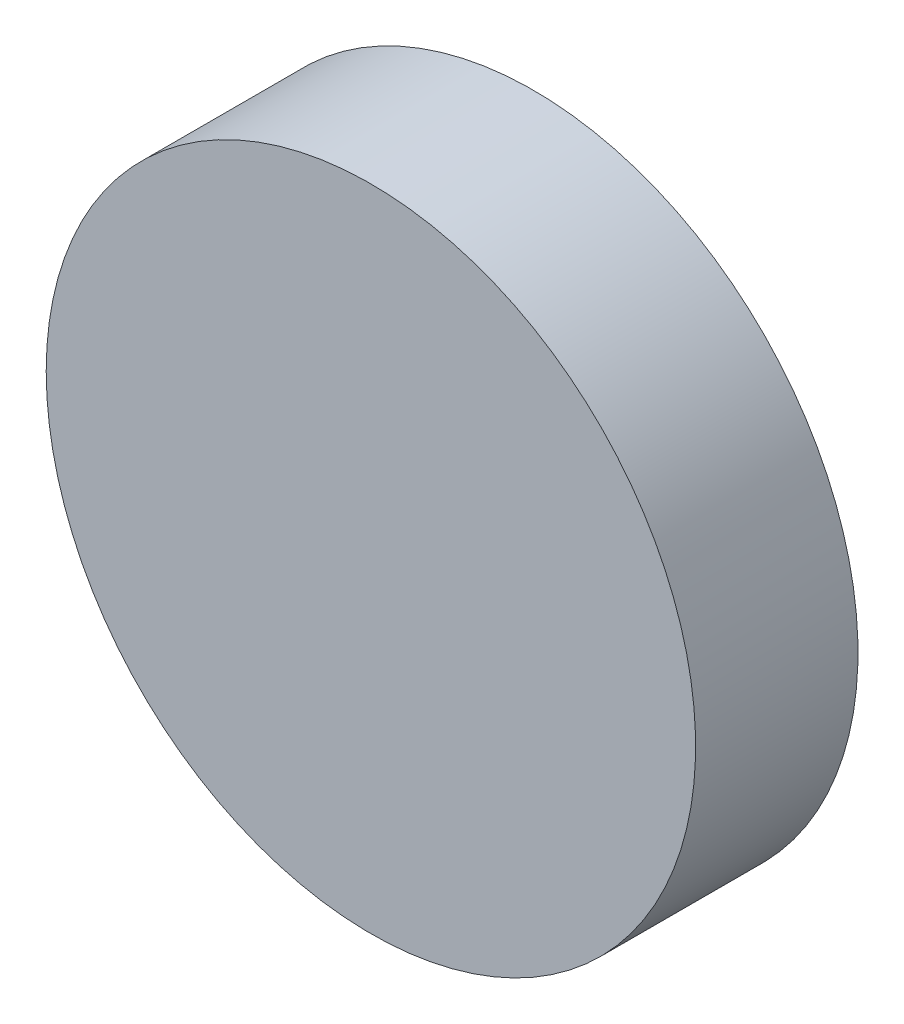
ISO-10303-21;
HEADER;
FILE_DESCRIPTION(('STEP AP214'),'2;1');
FILE_NAME('part.step','',(''),(''),'','','');
FILE_SCHEMA(('AUTOMOTIVE_DESIGN { 1 0 10303 214 1 1 1 1 }'));
ENDSEC;
DATA;
#1=APPLICATION_CONTEXT('core data for automotive mechanical design processes');
#2=APPLICATION_PROTOCOL_DEFINITION('international standard','automotive_design',2000,#1);
#3=PRODUCT_CONTEXT('',#1,'mechanical');
#4=PRODUCT('Part','Part','',(#3));
#5=PRODUCT_RELATED_PRODUCT_CATEGORY('part','',(#4));
#6=PRODUCT_DEFINITION_FORMATION('','',#4);
#7=PRODUCT_DEFINITION_CONTEXT('part definition',#1,'design');
#8=PRODUCT_DEFINITION('design','',#6,#7);
#9=PRODUCT_DEFINITION_SHAPE('','',#8);
#10=(LENGTH_UNIT() NAMED_UNIT(*) SI_UNIT(.MILLI.,.METRE.));
#11=(NAMED_UNIT(*) PLANE_ANGLE_UNIT() SI_UNIT($,.RADIAN.));
#12=(NAMED_UNIT(*) SI_UNIT($,.STERADIAN.) SOLID_ANGLE_UNIT());
#13=UNCERTAINTY_MEASURE_WITH_UNIT(LENGTH_MEASURE(1.E-05),#10,'distance_accuracy_value','');
#14=(GEOMETRIC_REPRESENTATION_CONTEXT(3) GLOBAL_UNCERTAINTY_ASSIGNED_CONTEXT((#13)) GLOBAL_UNIT_ASSIGNED_CONTEXT((#10,
#11,#12)) REPRESENTATION_CONTEXT('',''));
#15=CARTESIAN_POINT('',(0.,0.,0.));
#16=DIRECTION('',(0.,0.,1.));
#17=DIRECTION('',(1.,0.,0.));
#18=AXIS2_PLACEMENT_3D('',#15,#16,#17);
#19=CARTESIAN_POINT('',(0.1999996,0.,0.0999998));
#20=DIRECTION('',(0.,0.,-1.));
#21=DIRECTION('',(-1.,0.,0.));
#22=AXIS2_PLACEMENT_3D('',#19,#20,#21);
#23=PLANE('',#22);
#24=CARTESIAN_POINT('',(0.,0.,0.0999998));
#25=DIRECTION('',(0.,0.,-1.));
#26=DIRECTION('',(-1.,0.,0.));
#27=AXIS2_PLACEMENT_3D('',#24,#25,#26);
#28=CIRCLE('',#27,0.1999996);
#29=CARTESIAN_POINT('',(-0.1999996,0.,0.0999998));
#30=VERTEX_POINT('',#29);
#31=EDGE_CURVE('E18',#30,#30,#28,.T.);
#32=ORIENTED_EDGE('',*,*,#31,.F.);
#33=EDGE_LOOP('',(#32));
#34=FACE_BOUND('',#33,.T.);
#35=ADVANCED_FACE('F15',(#34),#23,.F.);
#36=CARTESIAN_POINT('',(0.,0.,0.));
#37=DIRECTION('',(0.,0.,-1.));
#38=DIRECTION('',(-1.,0.,0.));
#39=AXIS2_PLACEMENT_3D('',#36,#37,#38);
#40=CYLINDRICAL_SURFACE('',#39,0.1999996);
#41=ORIENTED_EDGE('',*,*,#31,.T.);
#42=EDGE_LOOP('',(#41));
#43=FACE_BOUND('',#42,.T.);
#44=CARTESIAN_POINT('',(0.,0.,0.));
#45=DIRECTION('',(0.,0.,-1.));
#46=DIRECTION('',(-1.,0.,0.));
#47=AXIS2_PLACEMENT_3D('',#44,#45,#46);
#48=CIRCLE('',#47,0.1999996);
#49=CARTESIAN_POINT('',(-0.1999996,0.,0.));
#50=VERTEX_POINT('',#49);
#51=EDGE_CURVE('E10',#50,#50,#48,.T.);
#52=ORIENTED_EDGE('',*,*,#51,.F.);
#53=EDGE_LOOP('',(#52));
#54=FACE_BOUND('',#53,.T.);
#55=ADVANCED_FACE('F27',(#43,#54),#40,.T.);
#56=CARTESIAN_POINT('',(0.1999996,0.,0.));
#57=DIRECTION('',(0.,0.,-1.));
#58=DIRECTION('',(-1.,0.,0.));
#59=AXIS2_PLACEMENT_3D('',#56,#57,#58);
#60=PLANE('',#59);
#61=ORIENTED_EDGE('',*,*,#51,.T.);
#62=EDGE_LOOP('',(#61));
#63=FACE_BOUND('',#62,.T.);
#64=ADVANCED_FACE('F35',(#63),#60,.T.);
#65=CLOSED_SHELL('',(#35,#55,#64));
#66=MANIFOLD_SOLID_BREP('B1',#65);
#67=ADVANCED_BREP_SHAPE_REPRESENTATION('',(#18,#66),#14);
#68=SHAPE_DEFINITION_REPRESENTATION(#9,#67);
ENDSEC;
END-ISO-10303-21;
